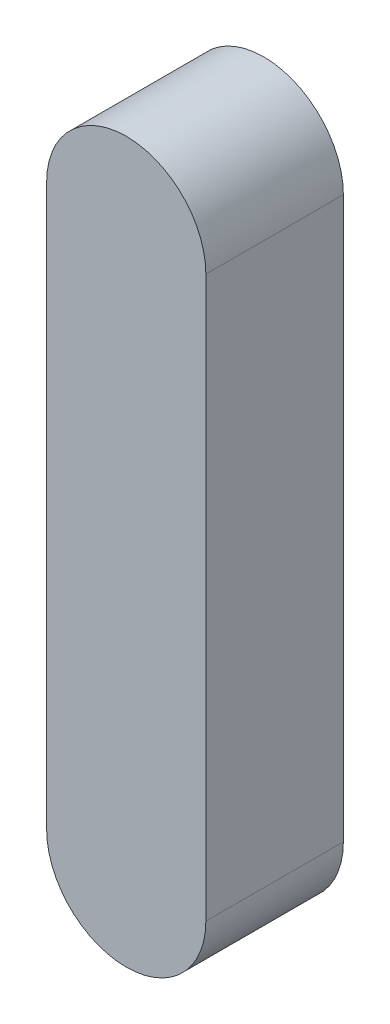
ISO-10303-21;
HEADER;
FILE_DESCRIPTION(('STEP AP214'),'2;1');
FILE_NAME('part.step','',(''),(''),'','','');
FILE_SCHEMA(('AUTOMOTIVE_DESIGN { 1 0 10303 214 1 1 1 1 }'));
ENDSEC;
DATA;
#1=APPLICATION_CONTEXT('core data for automotive mechanical design processes');
#2=APPLICATION_PROTOCOL_DEFINITION('international standard','automotive_design',2000,#1);
#3=PRODUCT_CONTEXT('',#1,'mechanical');
#4=PRODUCT('Part','Part','',(#3));
#5=PRODUCT_RELATED_PRODUCT_CATEGORY('part','',(#4));
#6=PRODUCT_DEFINITION_FORMATION('','',#4);
#7=PRODUCT_DEFINITION_CONTEXT('part definition',#1,'design');
#8=PRODUCT_DEFINITION('design','',#6,#7);
#9=PRODUCT_DEFINITION_SHAPE('','',#8);
#10=(LENGTH_UNIT() NAMED_UNIT(*) SI_UNIT(.MILLI.,.METRE.));
#11=(NAMED_UNIT(*) PLANE_ANGLE_UNIT() SI_UNIT($,.RADIAN.));
#12=(NAMED_UNIT(*) SI_UNIT($,.STERADIAN.) SOLID_ANGLE_UNIT());
#13=UNCERTAINTY_MEASURE_WITH_UNIT(LENGTH_MEASURE(1.E-05),#10,'distance_accuracy_value','');
#14=(GEOMETRIC_REPRESENTATION_CONTEXT(3) GLOBAL_UNCERTAINTY_ASSIGNED_CONTEXT((#13)) GLOBAL_UNIT_ASSIGNED_CONTEXT((#10,
#11,#12)) REPRESENTATION_CONTEXT('',''));
#15=CARTESIAN_POINT('',(0.,0.,0.));
#16=DIRECTION('',(0.,0.,1.));
#17=DIRECTION('',(1.,0.,0.));
#18=AXIS2_PLACEMENT_3D('',#15,#16,#17);
#19=CARTESIAN_POINT('',(0.,0.,-649.529585194511));
#20=DIRECTION('',(0.,0.,1.));
#21=DIRECTION('',(1.,0.,0.));
#22=AXIS2_PLACEMENT_3D('',#19,#20,#21);
#23=CYLINDRICAL_SURFACE('',#22,63.6764968426815);
#24=CARTESIAN_POINT('',(0.,0.,-54.9999999999992));
#25=DIRECTION('',(0.,0.,1.));
#26=DIRECTION('',(0.,-1.,0.));
#27=AXIS2_PLACEMENT_3D('',#24,#25,#26);
#28=CIRCLE('',#27,63.6764968426815);
#29=CARTESIAN_POINT('',(63.6764968426815,0.,-54.9999999999992));
#30=VERTEX_POINT('',#29);
#31=CARTESIAN_POINT('',(-63.6764968426815,0.,-54.9999999999993));
#32=VERTEX_POINT('',#31);
#33=EDGE_CURVE('E49',#30,#32,#28,.F.);
#34=ORIENTED_EDGE('',*,*,#33,.F.);
#35=DIRECTION('',(0.,0.,1.));
#36=VECTOR('',#35,1.);
#37=CARTESIAN_POINT('',(63.6764968426815,0.,-649.529585194511));
#38=LINE('',#37,#36);
#39=CARTESIAN_POINT('',(63.6764968426815,0.,55.0000000000008));
#40=VERTEX_POINT('',#39);
#41=EDGE_CURVE('E108',#30,#40,#38,.T.);
#42=ORIENTED_EDGE('',*,*,#41,.T.);
#43=CARTESIAN_POINT('',(0.,0.,55.0000000000007));
#44=DIRECTION('',(0.,0.,-1.));
#45=DIRECTION('',(0.,1.,0.));
#46=AXIS2_PLACEMENT_3D('',#43,#44,#45);
#47=CIRCLE('',#46,63.6764968426815);
#48=CARTESIAN_POINT('',(-63.6764968426815,0.,55.0000000000006));
#49=VERTEX_POINT('',#48);
#50=EDGE_CURVE('E102',#40,#49,#47,.T.);
#51=ORIENTED_EDGE('',*,*,#50,.T.);
#52=DIRECTION('',(0.,0.,1.));
#53=VECTOR('',#52,1.);
#54=CARTESIAN_POINT('',(-63.6764968426815,0.,-649.529585194511));
#55=LINE('',#54,#53);
#56=EDGE_CURVE('E84',#32,#49,#55,.T.);
#57=ORIENTED_EDGE('',*,*,#56,.F.);
#58=EDGE_LOOP('',(#34,#42,#51,#57));
#59=FACE_BOUND('',#58,.T.);
#60=ADVANCED_FACE('F41',(#59),#23,.T.);
#61=CARTESIAN_POINT('',(-63.6764968426815,0.,-649.529585194511));
#62=DIRECTION('',(-1.,0.,0.));
#63=DIRECTION('',(0.,0.,1.));
#64=AXIS2_PLACEMENT_3D('',#61,#62,#63);
#65=PLANE('',#64);
#66=DIRECTION('',(0.,1.,0.));
#67=VECTOR('',#66,1.);
#68=CARTESIAN_POINT('',(-63.6764968426815,-1.35312389032277E-12,-54.9999999999993));
#69=LINE('',#68,#67);
#70=CARTESIAN_POINT('',(-63.6764968426815,448.256550032416,-54.9999999999982));
#71=VERTEX_POINT('',#70);
#72=EDGE_CURVE('E55',#32,#71,#69,.T.);
#73=ORIENTED_EDGE('',*,*,#72,.F.);
#74=ORIENTED_EDGE('',*,*,#56,.T.);
#75=DIRECTION('',(0.,1.,0.));
#76=VECTOR('',#75,1.);
#77=CARTESIAN_POINT('',(-63.6764968426815,1.5841450423291E-12,55.0000000000006));
#78=LINE('',#77,#76);
#79=CARTESIAN_POINT('',(-63.6764968426815,448.256550032416,55.0000000000012));
#80=VERTEX_POINT('',#79);
#81=EDGE_CURVE('E92',#49,#80,#78,.T.);
#82=ORIENTED_EDGE('',*,*,#81,.T.);
#83=DIRECTION('',(0.,0.,1.));
#84=VECTOR('',#83,1.);
#85=CARTESIAN_POINT('',(-63.6764968426815,448.256550032416,-649.529585194511));
#86=LINE('',#85,#84);
#87=EDGE_CURVE('E76',#71,#80,#86,.T.);
#88=ORIENTED_EDGE('',*,*,#87,.F.);
#89=EDGE_LOOP('',(#73,#74,#82,#88));
#90=FACE_BOUND('',#89,.T.);
#91=ADVANCED_FACE('F97',(#90),#65,.T.);
#92=CARTESIAN_POINT('',(0.,448.256550032416,-649.529585194511));
#93=DIRECTION('',(0.,0.,1.));
#94=DIRECTION('',(1.,0.,0.));
#95=AXIS2_PLACEMENT_3D('',#92,#93,#94);
#96=CYLINDRICAL_SURFACE('',#95,63.6764968426815);
#97=CARTESIAN_POINT('',(0.,448.256550032416,-54.9999999999982));
#98=DIRECTION('',(0.,0.,1.));
#99=DIRECTION('',(0.,-1.,0.));
#100=AXIS2_PLACEMENT_3D('',#97,#98,#99);
#101=CIRCLE('',#100,63.6764968426815);
#102=CARTESIAN_POINT('',(63.6764968426815,448.256550032416,-54.9999999999986));
#103=VERTEX_POINT('',#102);
#104=EDGE_CURVE('E81',#71,#103,#101,.F.);
#105=ORIENTED_EDGE('',*,*,#104,.F.);
#106=ORIENTED_EDGE('',*,*,#87,.T.);
#107=CARTESIAN_POINT('',(0.,448.256550032416,55.0000000000019));
#108=DIRECTION('',(0.,0.,-1.));
#109=DIRECTION('',(0.,1.,0.));
#110=AXIS2_PLACEMENT_3D('',#107,#108,#109);
#111=CIRCLE('',#110,63.6764968426815);
#112=CARTESIAN_POINT('',(63.6764968426815,448.256550032416,55.000000000002));
#113=VERTEX_POINT('',#112);
#114=EDGE_CURVE('E80',#80,#113,#111,.T.);
#115=ORIENTED_EDGE('',*,*,#114,.T.);
#116=DIRECTION('',(0.,0.,1.));
#117=VECTOR('',#116,1.);
#118=CARTESIAN_POINT('',(63.6764968426815,448.256550032416,-649.529585194511));
#119=LINE('',#118,#117);
#120=EDGE_CURVE('E85',#103,#113,#119,.T.);
#121=ORIENTED_EDGE('',*,*,#120,.F.);
#122=EDGE_LOOP('',(#105,#106,#115,#121));
#123=FACE_BOUND('',#122,.T.);
#124=ADVANCED_FACE('F78',(#123),#96,.T.);
#125=CARTESIAN_POINT('',(63.6764968426815,0.,-649.529585194511));
#126=DIRECTION('',(1.,0.,0.));
#127=DIRECTION('',(0.,0.,-1.));
#128=AXIS2_PLACEMENT_3D('',#125,#126,#127);
#129=PLANE('',#128);
#130=DIRECTION('',(0.,-1.,0.));
#131=VECTOR('',#130,1.);
#132=CARTESIAN_POINT('',(63.6764968426815,-1.35312389032277E-12,-54.9999999999992));
#133=LINE('',#132,#131);
#134=EDGE_CURVE('E12',#103,#30,#133,.T.);
#135=ORIENTED_EDGE('',*,*,#134,.F.);
#136=ORIENTED_EDGE('',*,*,#120,.T.);
#137=DIRECTION('',(0.,-1.,0.));
#138=VECTOR('',#137,1.);
#139=CARTESIAN_POINT('',(63.6764968426815,1.5841450423291E-12,55.0000000000008));
#140=LINE('',#139,#138);
#141=EDGE_CURVE('E95',#113,#40,#140,.T.);
#142=ORIENTED_EDGE('',*,*,#141,.T.);
#143=ORIENTED_EDGE('',*,*,#41,.F.);
#144=EDGE_LOOP('',(#135,#136,#142,#143));
#145=FACE_BOUND('',#144,.T.);
#146=ADVANCED_FACE('F114',(#145),#129,.T.);
#147=CARTESIAN_POINT('',(-438.700966795602,508.862910549201,-54.9999999999985));
#148=DIRECTION('',(0.,0.,1.));
#149=DIRECTION('',(0.706697168205992,0.707516157023734,0.));
#150=AXIS2_PLACEMENT_3D('',#147,#148,#149);
#151=PLANE('',#150);
#152=ORIENTED_EDGE('',*,*,#33,.T.);
#153=ORIENTED_EDGE('',*,*,#72,.T.);
#154=ORIENTED_EDGE('',*,*,#104,.T.);
#155=ORIENTED_EDGE('',*,*,#134,.T.);
#156=EDGE_LOOP('',(#152,#153,#154,#155));
#157=FACE_BOUND('',#156,.T.);
#158=ADVANCED_FACE('F115',(#157),#151,.F.);
#159=CARTESIAN_POINT('',(-438.700966795602,508.862910549201,55.0000000000015));
#160=DIRECTION('',(0.,0.,-1.));
#161=DIRECTION('',(-0.706697168205991,-0.707516157023733,0.));
#162=AXIS2_PLACEMENT_3D('',#159,#160,#161);
#163=PLANE('',#162);
#164=ORIENTED_EDGE('',*,*,#141,.F.);
#165=ORIENTED_EDGE('',*,*,#114,.F.);
#166=ORIENTED_EDGE('',*,*,#81,.F.);
#167=ORIENTED_EDGE('',*,*,#50,.F.);
#168=EDGE_LOOP('',(#164,#165,#166,#167));
#169=FACE_BOUND('',#168,.T.);
#170=ADVANCED_FACE('F90',(#169),#163,.F.);
#171=CLOSED_SHELL('',(#60,#91,#124,#146,#158,#170));
#172=MANIFOLD_SOLID_BREP('B2',#171);
#173=ADVANCED_BREP_SHAPE_REPRESENTATION('',(#18,#172),#14);
#174=SHAPE_DEFINITION_REPRESENTATION(#9,#173);
ENDSEC;
END-ISO-10303-21;
